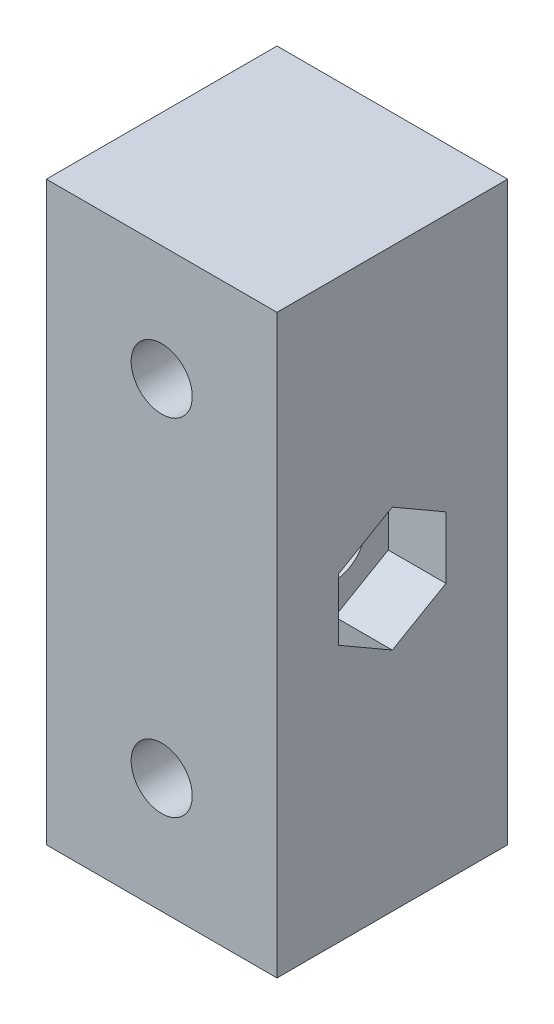
ISO-10303-21;
HEADER;
FILE_DESCRIPTION(('STEP AP214'),'2;1');
FILE_NAME('part.step','',(''),(''),'','','');
FILE_SCHEMA(('AUTOMOTIVE_DESIGN { 1 0 10303 214 1 1 1 1 }'));
ENDSEC;
DATA;
#1=APPLICATION_CONTEXT('core data for automotive mechanical design processes');
#2=APPLICATION_PROTOCOL_DEFINITION('international standard','automotive_design',2000,#1);
#3=PRODUCT_CONTEXT('',#1,'mechanical');
#4=PRODUCT('Part','Part','',(#3));
#5=PRODUCT_RELATED_PRODUCT_CATEGORY('part','',(#4));
#6=PRODUCT_DEFINITION_FORMATION('','',#4);
#7=PRODUCT_DEFINITION_CONTEXT('part definition',#1,'design');
#8=PRODUCT_DEFINITION('design','',#6,#7);
#9=PRODUCT_DEFINITION_SHAPE('','',#8);
#10=(LENGTH_UNIT() NAMED_UNIT(*) SI_UNIT(.MILLI.,.METRE.));
#11=(NAMED_UNIT(*) PLANE_ANGLE_UNIT() SI_UNIT($,.RADIAN.));
#12=(NAMED_UNIT(*) SI_UNIT($,.STERADIAN.) SOLID_ANGLE_UNIT());
#13=UNCERTAINTY_MEASURE_WITH_UNIT(LENGTH_MEASURE(1.E-05),#10,'distance_accuracy_value','');
#14=(GEOMETRIC_REPRESENTATION_CONTEXT(3) GLOBAL_UNCERTAINTY_ASSIGNED_CONTEXT((#13)) GLOBAL_UNIT_ASSIGNED_CONTEXT((#10,
#11,#12)) REPRESENTATION_CONTEXT('',''));
#15=CARTESIAN_POINT('',(0.,0.,0.));
#16=DIRECTION('',(0.,0.,1.));
#17=DIRECTION('',(1.,0.,0.));
#18=AXIS2_PLACEMENT_3D('',#15,#16,#17);
#19=CARTESIAN_POINT('',(865.,5.,-700.));
#20=DIRECTION('',(0.,1.,0.));
#21=DIRECTION('',(0.,0.,1.));
#22=AXIS2_PLACEMENT_3D('',#19,#20,#21);
#23=PLANE('',#22);
#24=DIRECTION('',(0.,0.,-1.));
#25=VECTOR('',#24,1.);
#26=CARTESIAN_POINT('',(885.,5.,0.));
#27=LINE('',#26,#25);
#28=CARTESIAN_POINT('',(885.,5.,-680.));
#29=VERTEX_POINT('',#28);
#30=CARTESIAN_POINT('',(885.,5.,-700.));
#31=VERTEX_POINT('',#30);
#32=EDGE_CURVE('E42',#29,#31,#27,.T.);
#33=ORIENTED_EDGE('',*,*,#32,.F.);
#34=DIRECTION('',(1.,0.,0.));
#35=VECTOR('',#34,1.);
#36=CARTESIAN_POINT('',(885.,5.,-680.));
#37=LINE('',#36,#35);
#38=CARTESIAN_POINT('',(865.,5.,-680.));
#39=VERTEX_POINT('',#38);
#40=EDGE_CURVE('E159',#39,#29,#37,.T.);
#41=ORIENTED_EDGE('',*,*,#40,.F.);
#42=DIRECTION('',(0.,0.,1.));
#43=VECTOR('',#42,1.);
#44=CARTESIAN_POINT('',(865.,5.,-700.));
#45=LINE('',#44,#43);
#46=CARTESIAN_POINT('',(865.,5.,-700.));
#47=VERTEX_POINT('',#46);
#48=EDGE_CURVE('E155',#47,#39,#45,.T.);
#49=ORIENTED_EDGE('',*,*,#48,.F.);
#50=DIRECTION('',(-1.,0.,0.));
#51=VECTOR('',#50,1.);
#52=CARTESIAN_POINT('',(0.,5.,-700.));
#53=LINE('',#52,#51);
#54=EDGE_CURVE('E141',#31,#47,#53,.T.);
#55=ORIENTED_EDGE('',*,*,#54,.F.);
#56=EDGE_LOOP('',(#33,#41,#49,#55));
#57=FACE_BOUND('',#56,.T.);
#58=ADVANCED_FACE('F38',(#57),#23,.F.);
#59=CARTESIAN_POINT('',(880.,0.,-700.));
#60=DIRECTION('',(-1.,0.,0.));
#61=DIRECTION('',(0.,0.,-1.));
#62=AXIS2_PLACEMENT_3D('',#59,#60,#61);
#63=PLANE('',#62);
#64=CARTESIAN_POINT('',(880.,30.,-690.));
#65=DIRECTION('',(-1.,0.,0.));
#66=DIRECTION('',(0.,0.,1.));
#67=AXIS2_PLACEMENT_3D('',#64,#65,#66);
#68=CIRCLE('',#67,2.65);
#69=CARTESIAN_POINT('',(880.,30.,-687.35));
#70=VERTEX_POINT('',#69);
#71=EDGE_CURVE('E236',#70,#70,#68,.T.);
#72=ORIENTED_EDGE('',*,*,#71,.T.);
#73=EDGE_LOOP('',(#72));
#74=FACE_BOUND('',#73,.T.);
#75=DIRECTION('',(0.,0.499999999999991,0.866025403784444));
#76=VECTOR('',#75,1.);
#77=CARTESIAN_POINT('',(880.,32.6846787517318,-694.65));
#78=LINE('',#77,#76);
#79=CARTESIAN_POINT('',(880.,32.6846787517318,-694.65));
#80=VERTEX_POINT('',#79);
#81=CARTESIAN_POINT('',(880.,35.3693575034635,-690.));
#82=VERTEX_POINT('',#81);
#83=EDGE_CURVE('E138',#80,#82,#78,.T.);
#84=ORIENTED_EDGE('',*,*,#83,.T.);
#85=DIRECTION('',(0.,-0.500000000000002,0.866025403784438));
#86=VECTOR('',#85,1.);
#87=CARTESIAN_POINT('',(880.,35.3693575034635,-690.));
#88=LINE('',#87,#86);
#89=CARTESIAN_POINT('',(880.,32.6846787517318,-685.35));
#90=VERTEX_POINT('',#89);
#91=EDGE_CURVE('E126',#82,#90,#88,.T.);
#92=ORIENTED_EDGE('',*,*,#91,.T.);
#93=DIRECTION('',(0.,1.,0.));
#94=VECTOR('',#93,1.);
#95=CARTESIAN_POINT('',(880.,27.3153212482683,-685.35));
#96=LINE('',#95,#94);
#97=CARTESIAN_POINT('',(880.,27.3153212482683,-685.35));
#98=VERTEX_POINT('',#97);
#99=EDGE_CURVE('E129',#98,#90,#96,.T.);
#100=ORIENTED_EDGE('',*,*,#99,.F.);
#101=DIRECTION('',(0.,0.5,0.866025403784439));
#102=VECTOR('',#101,1.);
#103=CARTESIAN_POINT('',(880.,24.6306424965365,-690.));
#104=LINE('',#103,#102);
#105=CARTESIAN_POINT('',(880.,24.6306424965365,-690.));
#106=VERTEX_POINT('',#105);
#107=EDGE_CURVE('E132',#106,#98,#104,.T.);
#108=ORIENTED_EDGE('',*,*,#107,.F.);
#109=DIRECTION('',(0.,0.500000000000003,-0.866025403784437));
#110=VECTOR('',#109,1.);
#111=CARTESIAN_POINT('',(880.,24.6306424965365,-690.));
#112=LINE('',#111,#110);
#113=CARTESIAN_POINT('',(880.,27.3153212482683,-694.65));
#114=VERTEX_POINT('',#113);
#115=EDGE_CURVE('E105',#106,#114,#112,.T.);
#116=ORIENTED_EDGE('',*,*,#115,.T.);
#117=DIRECTION('',(0.,1.,0.));
#118=VECTOR('',#117,1.);
#119=CARTESIAN_POINT('',(880.,27.3153212482683,-694.65));
#120=LINE('',#119,#118);
#121=EDGE_CURVE('E135',#114,#80,#120,.T.);
#122=ORIENTED_EDGE('',*,*,#121,.T.);
#123=EDGE_LOOP('',(#84,#92,#100,#108,#116,#122));
#124=FACE_BOUND('',#123,.T.);
#125=ADVANCED_FACE('F316',(#74,#124),#63,.F.);
#126=CARTESIAN_POINT('',(0.,0.,-695.));
#127=DIRECTION('',(0.,0.,-1.));
#128=DIRECTION('',(1.,0.,0.));
#129=AXIS2_PLACEMENT_3D('',#126,#127,#128);
#130=PLANE('',#129);
#131=CARTESIAN_POINT('',(875.,15.,-695.));
#132=DIRECTION('',(0.,0.,-1.));
#133=DIRECTION('',(-1.,0.,0.));
#134=AXIS2_PLACEMENT_3D('',#131,#132,#133);
#135=CIRCLE('',#134,2.64999999999999);
#136=CARTESIAN_POINT('',(872.35,15.,-695.));
#137=VERTEX_POINT('',#136);
#138=EDGE_CURVE('E196',#137,#137,#135,.T.);
#139=ORIENTED_EDGE('',*,*,#138,.F.);
#140=EDGE_LOOP('',(#139));
#141=FACE_BOUND('',#140,.T.);
#142=DIRECTION('',(0.866025403784438,0.500000000000001,0.));
#143=VECTOR('',#142,1.);
#144=CARTESIAN_POINT('',(875.,9.63064249653649,-695.));
#145=LINE('',#144,#143);
#146=CARTESIAN_POINT('',(875.,9.63064249653649,-695.));
#147=VERTEX_POINT('',#146);
#148=CARTESIAN_POINT('',(879.65,12.3153212482683,-695.));
#149=VERTEX_POINT('',#148);
#150=EDGE_CURVE('E276',#147,#149,#145,.T.);
#151=ORIENTED_EDGE('',*,*,#150,.F.);
#152=DIRECTION('',(-0.866025403784436,0.500000000000004,0.));
#153=VECTOR('',#152,1.);
#154=CARTESIAN_POINT('',(875.,9.63064249653649,-695.));
#155=LINE('',#154,#153);
#156=CARTESIAN_POINT('',(870.35,12.3153212482682,-695.));
#157=VERTEX_POINT('',#156);
#158=EDGE_CURVE('E301',#147,#157,#155,.T.);
#159=ORIENTED_EDGE('',*,*,#158,.T.);
#160=DIRECTION('',(0.,1.,0.));
#161=VECTOR('',#160,1.);
#162=CARTESIAN_POINT('',(870.35,12.3153212482682,-695.));
#163=LINE('',#162,#161);
#164=CARTESIAN_POINT('',(870.35,17.6846787517318,-695.));
#165=VERTEX_POINT('',#164);
#166=EDGE_CURVE('E298',#157,#165,#163,.T.);
#167=ORIENTED_EDGE('',*,*,#166,.T.);
#168=DIRECTION('',(0.866025403784443,0.499999999999993,0.));
#169=VECTOR('',#168,1.);
#170=CARTESIAN_POINT('',(870.35,17.6846787517318,-695.));
#171=LINE('',#170,#169);
#172=CARTESIAN_POINT('',(875.,20.3693575034635,-695.));
#173=VERTEX_POINT('',#172);
#174=EDGE_CURVE('E295',#165,#173,#171,.T.);
#175=ORIENTED_EDGE('',*,*,#174,.T.);
#176=DIRECTION('',(0.866025403784438,-0.500000000000002,0.));
#177=VECTOR('',#176,1.);
#178=CARTESIAN_POINT('',(875.,20.3693575034635,-695.));
#179=LINE('',#178,#177);
#180=CARTESIAN_POINT('',(879.65,17.6846787517318,-695.));
#181=VERTEX_POINT('',#180);
#182=EDGE_CURVE('E292',#173,#181,#179,.T.);
#183=ORIENTED_EDGE('',*,*,#182,.T.);
#184=DIRECTION('',(0.,1.,0.));
#185=VECTOR('',#184,1.);
#186=CARTESIAN_POINT('',(879.65,12.3153212482683,-695.));
#187=LINE('',#186,#185);
#188=EDGE_CURVE('E256',#149,#181,#187,.T.);
#189=ORIENTED_EDGE('',*,*,#188,.F.);
#190=EDGE_LOOP('',(#151,#159,#167,#175,#183,#189));
#191=FACE_BOUND('',#190,.T.);
#192=ADVANCED_FACE('F338',(#141,#191),#130,.T.);
#193=CARTESIAN_POINT('',(0.,0.,-695.));
#194=DIRECTION('',(0.,0.,1.));
#195=DIRECTION('',(-1.,0.,0.));
#196=AXIS2_PLACEMENT_3D('',#193,#194,#195);
#197=PLANE('',#196);
#198=CARTESIAN_POINT('',(875.,45.,-695.));
#199=DIRECTION('',(0.,0.,1.));
#200=DIRECTION('',(1.,0.,0.));
#201=AXIS2_PLACEMENT_3D('',#198,#199,#200);
#202=CIRCLE('',#201,2.64999999999999);
#203=CARTESIAN_POINT('',(877.65,45.,-695.));
#204=VERTEX_POINT('',#203);
#205=EDGE_CURVE('E163',#204,#204,#202,.T.);
#206=ORIENTED_EDGE('',*,*,#205,.T.);
#207=EDGE_LOOP('',(#206));
#208=FACE_BOUND('',#207,.T.);
#209=DIRECTION('',(-0.866025403784436,0.500000000000004,0.));
#210=VECTOR('',#209,1.);
#211=CARTESIAN_POINT('',(875.,39.6306424965365,-695.));
#212=LINE('',#211,#210);
#213=CARTESIAN_POINT('',(875.,39.6306424965365,-695.));
#214=VERTEX_POINT('',#213);
#215=CARTESIAN_POINT('',(870.35,42.3153212482682,-695.));
#216=VERTEX_POINT('',#215);
#217=EDGE_CURVE('E221',#214,#216,#212,.T.);
#218=ORIENTED_EDGE('',*,*,#217,.T.);
#219=DIRECTION('',(0.,1.,0.));
#220=VECTOR('',#219,1.);
#221=CARTESIAN_POINT('',(870.35,42.3153212482682,-695.));
#222=LINE('',#221,#220);
#223=CARTESIAN_POINT('',(870.35,47.6846787517318,-695.));
#224=VERTEX_POINT('',#223);
#225=EDGE_CURVE('E216',#216,#224,#222,.T.);
#226=ORIENTED_EDGE('',*,*,#225,.T.);
#227=DIRECTION('',(0.866025403784443,0.499999999999992,0.));
#228=VECTOR('',#227,1.);
#229=CARTESIAN_POINT('',(870.35,47.6846787517318,-695.));
#230=LINE('',#229,#228);
#231=CARTESIAN_POINT('',(875.,50.3693575034635,-695.));
#232=VERTEX_POINT('',#231);
#233=EDGE_CURVE('E239',#224,#232,#230,.T.);
#234=ORIENTED_EDGE('',*,*,#233,.T.);
#235=DIRECTION('',(0.866025403784438,-0.500000000000001,0.));
#236=VECTOR('',#235,1.);
#237=CARTESIAN_POINT('',(875.,50.3693575034635,-695.));
#238=LINE('',#237,#236);
#239=CARTESIAN_POINT('',(879.65,47.6846787517318,-695.));
#240=VERTEX_POINT('',#239);
#241=EDGE_CURVE('E242',#232,#240,#238,.T.);
#242=ORIENTED_EDGE('',*,*,#241,.T.);
#243=DIRECTION('',(0.,1.,0.));
#244=VECTOR('',#243,1.);
#245=CARTESIAN_POINT('',(879.65,42.3153212482683,-695.));
#246=LINE('',#245,#244);
#247=CARTESIAN_POINT('',(879.65,42.3153212482683,-695.));
#248=VERTEX_POINT('',#247);
#249=EDGE_CURVE('E245',#248,#240,#246,.T.);
#250=ORIENTED_EDGE('',*,*,#249,.F.);
#251=DIRECTION('',(0.866025403784439,0.5,0.));
#252=VECTOR('',#251,1.);
#253=CARTESIAN_POINT('',(875.,39.6306424965365,-695.));
#254=LINE('',#253,#252);
#255=EDGE_CURVE('E248',#214,#248,#254,.T.);
#256=ORIENTED_EDGE('',*,*,#255,.F.);
#257=EDGE_LOOP('',(#218,#226,#234,#242,#250,#256));
#258=FACE_BOUND('',#257,.T.);
#259=ADVANCED_FACE('F387',(#208,#258),#197,.F.);
#260=CARTESIAN_POINT('',(870.35,47.6846787517318,-695.));
#261=DIRECTION('',(-0.499999999999992,0.866025403784443,0.));
#262=DIRECTION('',(-0.866025403784443,-0.499999999999992,0.));
#263=AXIS2_PLACEMENT_3D('',#260,#261,#262);
#264=PLANE('',#263);
#265=DIRECTION('',(0.866025403784443,0.499999999999992,0.));
#266=VECTOR('',#265,1.);
#267=CARTESIAN_POINT('',(870.35,47.6846787517318,-700.));
#268=LINE('',#267,#266);
#269=CARTESIAN_POINT('',(870.35,47.6846787517318,-700.));
#270=VERTEX_POINT('',#269);
#271=CARTESIAN_POINT('',(875.,50.3693575034635,-700.));
#272=VERTEX_POINT('',#271);
#273=EDGE_CURVE('E220',#270,#272,#268,.T.);
#274=ORIENTED_EDGE('',*,*,#273,.T.);
#275=DIRECTION('',(0.,0.,-1.));
#276=VECTOR('',#275,1.);
#277=CARTESIAN_POINT('',(875.,50.3693575034635,-695.));
#278=LINE('',#277,#276);
#279=EDGE_CURVE('E207',#232,#272,#278,.T.);
#280=ORIENTED_EDGE('',*,*,#279,.F.);
#281=ORIENTED_EDGE('',*,*,#233,.F.);
#282=DIRECTION('',(0.,0.,-1.));
#283=VECTOR('',#282,1.);
#284=CARTESIAN_POINT('',(870.35,47.6846787517318,-695.));
#285=LINE('',#284,#283);
#286=EDGE_CURVE('E210',#224,#270,#285,.T.);
#287=ORIENTED_EDGE('',*,*,#286,.T.);
#288=EDGE_LOOP('',(#274,#280,#281,#287));
#289=FACE_BOUND('',#288,.T.);
#290=ADVANCED_FACE('F383',(#289),#264,.F.);
#291=CARTESIAN_POINT('',(875.,50.3693575034635,-695.));
#292=DIRECTION('',(0.500000000000001,0.866025403784438,0.));
#293=DIRECTION('',(-0.866025403784438,0.500000000000001,0.));
#294=AXIS2_PLACEMENT_3D('',#291,#292,#293);
#295=PLANE('',#294);
#296=DIRECTION('',(0.866025403784438,-0.500000000000001,0.));
#297=VECTOR('',#296,1.);
#298=CARTESIAN_POINT('',(875.,50.3693575034635,-700.));
#299=LINE('',#298,#297);
#300=CARTESIAN_POINT('',(879.65,47.6846787517318,-700.));
#301=VERTEX_POINT('',#300);
#302=EDGE_CURVE('E224',#272,#301,#299,.T.);
#303=ORIENTED_EDGE('',*,*,#302,.T.);
#304=DIRECTION('',(0.,0.,-1.));
#305=VECTOR('',#304,1.);
#306=CARTESIAN_POINT('',(879.65,47.6846787517318,-695.));
#307=LINE('',#306,#305);
#308=EDGE_CURVE('E204',#240,#301,#307,.T.);
#309=ORIENTED_EDGE('',*,*,#308,.F.);
#310=ORIENTED_EDGE('',*,*,#241,.F.);
#311=ORIENTED_EDGE('',*,*,#279,.T.);
#312=EDGE_LOOP('',(#303,#309,#310,#311));
#313=FACE_BOUND('',#312,.T.);
#314=ADVANCED_FACE('F379',(#313),#295,.F.);
#315=CARTESIAN_POINT('',(879.65,42.3153212482683,-695.));
#316=DIRECTION('',(-1.,0.,0.));
#317=DIRECTION('',(0.,0.,1.));
#318=AXIS2_PLACEMENT_3D('',#315,#316,#317);
#319=PLANE('',#318);
#320=DIRECTION('',(0.,1.,0.));
#321=VECTOR('',#320,1.);
#322=CARTESIAN_POINT('',(879.65,42.3153212482683,-700.));
#323=LINE('',#322,#321);
#324=CARTESIAN_POINT('',(879.65,42.3153212482683,-700.));
#325=VERTEX_POINT('',#324);
#326=EDGE_CURVE('E227',#325,#301,#323,.T.);
#327=ORIENTED_EDGE('',*,*,#326,.F.);
#328=DIRECTION('',(0.,0.,-1.));
#329=VECTOR('',#328,1.);
#330=CARTESIAN_POINT('',(879.65,42.3153212482683,-695.));
#331=LINE('',#330,#329);
#332=EDGE_CURVE('E200',#248,#325,#331,.T.);
#333=ORIENTED_EDGE('',*,*,#332,.F.);
#334=ORIENTED_EDGE('',*,*,#249,.T.);
#335=ORIENTED_EDGE('',*,*,#308,.T.);
#336=EDGE_LOOP('',(#327,#333,#334,#335));
#337=FACE_BOUND('',#336,.T.);
#338=ADVANCED_FACE('F375',(#337),#319,.T.);
#339=CARTESIAN_POINT('',(875.,39.6306424965365,-695.));
#340=DIRECTION('',(-0.5,0.866025403784439,0.));
#341=DIRECTION('',(-0.866025403784439,-0.5,0.));
#342=AXIS2_PLACEMENT_3D('',#339,#340,#341);
#343=PLANE('',#342);
#344=DIRECTION('',(0.866025403784439,0.5,0.));
#345=VECTOR('',#344,1.);
#346=CARTESIAN_POINT('',(875.,39.6306424965365,-700.));
#347=LINE('',#346,#345);
#348=CARTESIAN_POINT('',(875.,39.6306424965365,-700.));
#349=VERTEX_POINT('',#348);
#350=EDGE_CURVE('E230',#349,#325,#347,.T.);
#351=ORIENTED_EDGE('',*,*,#350,.F.);
#352=DIRECTION('',(0.,0.,-1.));
#353=VECTOR('',#352,1.);
#354=CARTESIAN_POINT('',(875.,39.6306424965365,-695.));
#355=LINE('',#354,#353);
#356=EDGE_CURVE('E197',#214,#349,#355,.T.);
#357=ORIENTED_EDGE('',*,*,#356,.F.);
#358=ORIENTED_EDGE('',*,*,#255,.T.);
#359=ORIENTED_EDGE('',*,*,#332,.T.);
#360=EDGE_LOOP('',(#351,#357,#358,#359));
#361=FACE_BOUND('',#360,.T.);
#362=ADVANCED_FACE('F371',(#361),#343,.T.);
#363=CARTESIAN_POINT('',(875.,39.6306424965365,-695.));
#364=DIRECTION('',(-0.500000000000004,-0.866025403784436,0.));
#365=DIRECTION('',(0.866025403784436,-0.500000000000004,0.));
#366=AXIS2_PLACEMENT_3D('',#363,#364,#365);
#367=PLANE('',#366);
#368=DIRECTION('',(-0.866025403784436,0.500000000000004,0.));
#369=VECTOR('',#368,1.);
#370=CARTESIAN_POINT('',(875.,39.6306424965365,-700.));
#371=LINE('',#370,#369);
#372=CARTESIAN_POINT('',(870.35,42.3153212482682,-700.));
#373=VERTEX_POINT('',#372);
#374=EDGE_CURVE('E233',#349,#373,#371,.T.);
#375=ORIENTED_EDGE('',*,*,#374,.T.);
#376=DIRECTION('',(0.,0.,-1.));
#377=VECTOR('',#376,1.);
#378=CARTESIAN_POINT('',(870.35,42.3153212482682,-695.));
#379=LINE('',#378,#377);
#380=EDGE_CURVE('E213',#216,#373,#379,.T.);
#381=ORIENTED_EDGE('',*,*,#380,.F.);
#382=ORIENTED_EDGE('',*,*,#217,.F.);
#383=ORIENTED_EDGE('',*,*,#356,.T.);
#384=EDGE_LOOP('',(#375,#381,#382,#383));
#385=FACE_BOUND('',#384,.T.);
#386=ADVANCED_FACE('F367',(#385),#367,.F.);
#387=CARTESIAN_POINT('',(870.35,42.3153212482682,-695.));
#388=DIRECTION('',(-1.,0.,0.));
#389=DIRECTION('',(0.,-1.,0.));
#390=AXIS2_PLACEMENT_3D('',#387,#388,#389);
#391=PLANE('',#390);
#392=DIRECTION('',(0.,1.,0.));
#393=VECTOR('',#392,1.);
#394=CARTESIAN_POINT('',(870.35,42.3153212482682,-700.));
#395=LINE('',#394,#393);
#396=EDGE_CURVE('E217',#373,#270,#395,.T.);
#397=ORIENTED_EDGE('',*,*,#396,.T.);
#398=ORIENTED_EDGE('',*,*,#286,.F.);
#399=ORIENTED_EDGE('',*,*,#225,.F.);
#400=ORIENTED_EDGE('',*,*,#380,.T.);
#401=EDGE_LOOP('',(#397,#398,#399,#400));
#402=FACE_BOUND('',#401,.T.);
#403=ADVANCED_FACE('F370',(#402),#391,.F.);
#404=CARTESIAN_POINT('',(875.,9.63064249653649,-695.));
#405=DIRECTION('',(-0.500000000000004,-0.866025403784436,0.));
#406=DIRECTION('',(0.866025403784436,-0.500000000000004,0.));
#407=AXIS2_PLACEMENT_3D('',#404,#405,#406);
#408=PLANE('',#407);
#409=DIRECTION('',(-0.866025403784436,0.500000000000004,0.));
#410=VECTOR('',#409,1.);
#411=CARTESIAN_POINT('',(875.,9.63064249653649,-700.));
#412=LINE('',#411,#410);
#413=CARTESIAN_POINT('',(875.,9.6306424965365,-700.));
#414=VERTEX_POINT('',#413);
#415=CARTESIAN_POINT('',(870.35,12.3153212482682,-700.));
#416=VERTEX_POINT('',#415);
#417=EDGE_CURVE('E285',#414,#416,#412,.T.);
#418=ORIENTED_EDGE('',*,*,#417,.T.);
#419=DIRECTION('',(0.,0.,-1.));
#420=VECTOR('',#419,1.);
#421=CARTESIAN_POINT('',(870.35,12.3153212482682,-695.));
#422=LINE('',#421,#420);
#423=EDGE_CURVE('E257',#157,#416,#422,.T.);
#424=ORIENTED_EDGE('',*,*,#423,.F.);
#425=ORIENTED_EDGE('',*,*,#158,.F.);
#426=DIRECTION('',(0.,0.,-1.));
#427=VECTOR('',#426,1.);
#428=CARTESIAN_POINT('',(875.,9.63064249653649,-695.));
#429=LINE('',#428,#427);
#430=EDGE_CURVE('E253',#147,#414,#429,.T.);
#431=ORIENTED_EDGE('',*,*,#430,.T.);
#432=EDGE_LOOP('',(#418,#424,#425,#431));
#433=FACE_BOUND('',#432,.T.);
#434=ADVANCED_FACE('F391',(#433),#408,.F.);
#435=CARTESIAN_POINT('',(870.35,12.3153212482682,-695.));
#436=DIRECTION('',(-1.,0.,0.));
#437=DIRECTION('',(0.,-1.,0.));
#438=AXIS2_PLACEMENT_3D('',#435,#436,#437);
#439=PLANE('',#438);
#440=DIRECTION('',(0.,1.,0.));
#441=VECTOR('',#440,1.);
#442=CARTESIAN_POINT('',(870.35,12.3153212482682,-700.));
#443=LINE('',#442,#441);
#444=CARTESIAN_POINT('',(870.35,17.6846787517318,-700.));
#445=VERTEX_POINT('',#444);
#446=EDGE_CURVE('E282',#416,#445,#443,.T.);
#447=ORIENTED_EDGE('',*,*,#446,.T.);
#448=DIRECTION('',(0.,0.,-1.));
#449=VECTOR('',#448,1.);
#450=CARTESIAN_POINT('',(870.35,17.6846787517318,-695.));
#451=LINE('',#450,#449);
#452=EDGE_CURVE('E260',#165,#445,#451,.T.);
#453=ORIENTED_EDGE('',*,*,#452,.F.);
#454=ORIENTED_EDGE('',*,*,#166,.F.);
#455=ORIENTED_EDGE('',*,*,#423,.T.);
#456=EDGE_LOOP('',(#447,#453,#454,#455));
#457=FACE_BOUND('',#456,.T.);
#458=ADVANCED_FACE('F403',(#457),#439,.F.);
#459=CARTESIAN_POINT('',(870.35,17.6846787517318,-695.));
#460=DIRECTION('',(-0.499999999999993,0.866025403784443,0.));
#461=DIRECTION('',(-0.866025403784443,-0.499999999999993,0.));
#462=AXIS2_PLACEMENT_3D('',#459,#460,#461);
#463=PLANE('',#462);
#464=DIRECTION('',(0.866025403784443,0.499999999999993,0.));
#465=VECTOR('',#464,1.);
#466=CARTESIAN_POINT('',(870.35,17.6846787517318,-700.));
#467=LINE('',#466,#465);
#468=CARTESIAN_POINT('',(875.,20.3693575034635,-700.));
#469=VERTEX_POINT('',#468);
#470=EDGE_CURVE('E279',#445,#469,#467,.T.);
#471=ORIENTED_EDGE('',*,*,#470,.T.);
#472=DIRECTION('',(0.,0.,-1.));
#473=VECTOR('',#472,1.);
#474=CARTESIAN_POINT('',(875.,20.3693575034635,-695.));
#475=LINE('',#474,#473);
#476=EDGE_CURVE('E263',#173,#469,#475,.T.);
#477=ORIENTED_EDGE('',*,*,#476,.F.);
#478=ORIENTED_EDGE('',*,*,#174,.F.);
#479=ORIENTED_EDGE('',*,*,#452,.T.);
#480=EDGE_LOOP('',(#471,#477,#478,#479));
#481=FACE_BOUND('',#480,.T.);
#482=ADVANCED_FACE('F407',(#481),#463,.F.);
#483=CARTESIAN_POINT('',(875.,20.3693575034635,-695.));
#484=DIRECTION('',(0.500000000000002,0.866025403784438,0.));
#485=DIRECTION('',(-0.866025403784437,0.500000000000002,0.));
#486=AXIS2_PLACEMENT_3D('',#483,#484,#485);
#487=PLANE('',#486);
#488=DIRECTION('',(0.866025403784438,-0.500000000000002,0.));
#489=VECTOR('',#488,1.);
#490=CARTESIAN_POINT('',(875.,20.3693575034635,-700.));
#491=LINE('',#490,#489);
#492=CARTESIAN_POINT('',(879.65,17.6846787517318,-700.));
#493=VERTEX_POINT('',#492);
#494=EDGE_CURVE('E275',#469,#493,#491,.T.);
#495=ORIENTED_EDGE('',*,*,#494,.T.);
#496=DIRECTION('',(0.,0.,-1.));
#497=VECTOR('',#496,1.);
#498=CARTESIAN_POINT('',(879.65,17.6846787517318,-695.));
#499=LINE('',#498,#497);
#500=EDGE_CURVE('E266',#181,#493,#499,.T.);
#501=ORIENTED_EDGE('',*,*,#500,.F.);
#502=ORIENTED_EDGE('',*,*,#182,.F.);
#503=ORIENTED_EDGE('',*,*,#476,.T.);
#504=EDGE_LOOP('',(#495,#501,#502,#503));
#505=FACE_BOUND('',#504,.T.);
#506=ADVANCED_FACE('F411',(#505),#487,.F.);
#507=CARTESIAN_POINT('',(879.65,12.3153212482683,-695.));
#508=DIRECTION('',(-1.,0.,0.));
#509=DIRECTION('',(0.,0.,1.));
#510=AXIS2_PLACEMENT_3D('',#507,#508,#509);
#511=PLANE('',#510);
#512=DIRECTION('',(0.,1.,0.));
#513=VECTOR('',#512,1.);
#514=CARTESIAN_POINT('',(879.65,12.3153212482683,-700.));
#515=LINE('',#514,#513);
#516=CARTESIAN_POINT('',(879.65,12.3153212482683,-700.));
#517=VERTEX_POINT('',#516);
#518=EDGE_CURVE('E272',#517,#493,#515,.T.);
#519=ORIENTED_EDGE('',*,*,#518,.F.);
#520=DIRECTION('',(0.,0.,-1.));
#521=VECTOR('',#520,1.);
#522=CARTESIAN_POINT('',(879.65,12.3153212482683,-695.));
#523=LINE('',#522,#521);
#524=EDGE_CURVE('E269',#149,#517,#523,.T.);
#525=ORIENTED_EDGE('',*,*,#524,.F.);
#526=ORIENTED_EDGE('',*,*,#188,.T.);
#527=ORIENTED_EDGE('',*,*,#500,.T.);
#528=EDGE_LOOP('',(#519,#525,#526,#527));
#529=FACE_BOUND('',#528,.T.);
#530=ADVANCED_FACE('F399',(#529),#511,.T.);
#531=CARTESIAN_POINT('',(875.,9.63064249653649,-695.));
#532=DIRECTION('',(-0.500000000000001,0.866025403784438,0.));
#533=DIRECTION('',(-0.866025403784438,-0.500000000000001,0.));
#534=AXIS2_PLACEMENT_3D('',#531,#532,#533);
#535=PLANE('',#534);
#536=DIRECTION('',(0.866025403784438,0.500000000000001,0.));
#537=VECTOR('',#536,1.);
#538=CARTESIAN_POINT('',(875.,9.63064249653649,-700.));
#539=LINE('',#538,#537);
#540=EDGE_CURVE('E201',#414,#517,#539,.T.);
#541=ORIENTED_EDGE('',*,*,#540,.F.);
#542=ORIENTED_EDGE('',*,*,#430,.F.);
#543=ORIENTED_EDGE('',*,*,#150,.T.);
#544=ORIENTED_EDGE('',*,*,#524,.T.);
#545=EDGE_LOOP('',(#541,#542,#543,#544));
#546=FACE_BOUND('',#545,.T.);
#547=ADVANCED_FACE('F396',(#546),#535,.T.);
#548=CARTESIAN_POINT('',(880.,27.3153212482683,-685.35));
#549=DIRECTION('',(0.,0.,-1.));
#550=DIRECTION('',(0.,1.,0.));
#551=AXIS2_PLACEMENT_3D('',#548,#549,#550);
#552=PLANE('',#551);
#553=DIRECTION('',(0.,1.,0.));
#554=VECTOR('',#553,1.);
#555=CARTESIAN_POINT('',(885.,27.3153212482683,-685.35));
#556=LINE('',#555,#554);
#557=CARTESIAN_POINT('',(885.,27.3153212482683,-685.35));
#558=VERTEX_POINT('',#557);
#559=CARTESIAN_POINT('',(885.,32.6846787517318,-685.35));
#560=VERTEX_POINT('',#559);
#561=EDGE_CURVE('E116',#558,#560,#556,.T.);
#562=ORIENTED_EDGE('',*,*,#561,.F.);
#563=DIRECTION('',(1.,0.,0.));
#564=VECTOR('',#563,1.);
#565=CARTESIAN_POINT('',(880.,27.3153212482683,-685.35));
#566=LINE('',#565,#564);
#567=EDGE_CURVE('E108',#98,#558,#566,.T.);
#568=ORIENTED_EDGE('',*,*,#567,.F.);
#569=ORIENTED_EDGE('',*,*,#99,.T.);
#570=DIRECTION('',(1.,0.,0.));
#571=VECTOR('',#570,1.);
#572=CARTESIAN_POINT('',(880.,32.6846787517318,-685.35));
#573=LINE('',#572,#571);
#574=EDGE_CURVE('E90',#90,#560,#573,.T.);
#575=ORIENTED_EDGE('',*,*,#574,.T.);
#576=EDGE_LOOP('',(#562,#568,#569,#575));
#577=FACE_BOUND('',#576,.T.);
#578=ADVANCED_FACE('F313',(#577),#552,.T.);
#579=CARTESIAN_POINT('',(880.,24.6306424965365,-690.));
#580=DIRECTION('',(0.,0.866025403784439,-0.5));
#581=DIRECTION('',(0.,0.5,0.866025403784439));
#582=AXIS2_PLACEMENT_3D('',#579,#580,#581);
#583=PLANE('',#582);
#584=DIRECTION('',(0.,0.5,0.866025403784439));
#585=VECTOR('',#584,1.);
#586=CARTESIAN_POINT('',(885.,24.6306424965365,-690.));
#587=LINE('',#586,#585);
#588=CARTESIAN_POINT('',(885.,24.6306424965365,-690.));
#589=VERTEX_POINT('',#588);
#590=EDGE_CURVE('E111',#589,#558,#587,.T.);
#591=ORIENTED_EDGE('',*,*,#590,.F.);
#592=DIRECTION('',(1.,0.,0.));
#593=VECTOR('',#592,1.);
#594=CARTESIAN_POINT('',(880.,24.6306424965365,-690.));
#595=LINE('',#594,#593);
#596=EDGE_CURVE('E98',#106,#589,#595,.T.);
#597=ORIENTED_EDGE('',*,*,#596,.F.);
#598=ORIENTED_EDGE('',*,*,#107,.T.);
#599=ORIENTED_EDGE('',*,*,#567,.T.);
#600=EDGE_LOOP('',(#591,#597,#598,#599));
#601=FACE_BOUND('',#600,.T.);
#602=ADVANCED_FACE('F112',(#601),#583,.T.);
#603=CARTESIAN_POINT('',(880.,24.6306424965365,-690.));
#604=DIRECTION('',(0.,-0.866025403784437,-0.500000000000003));
#605=DIRECTION('',(0.,0.500000000000003,-0.866025403784437));
#606=AXIS2_PLACEMENT_3D('',#603,#604,#605);
#607=PLANE('',#606);
#608=DIRECTION('',(0.,0.500000000000003,-0.866025403784437));
#609=VECTOR('',#608,1.);
#610=CARTESIAN_POINT('',(885.,24.6306424965365,-690.));
#611=LINE('',#610,#609);
#612=CARTESIAN_POINT('',(885.,27.3153212482683,-694.65));
#613=VERTEX_POINT('',#612);
#614=EDGE_CURVE('E102',#589,#613,#611,.T.);
#615=ORIENTED_EDGE('',*,*,#614,.T.);
#616=DIRECTION('',(1.,0.,0.));
#617=VECTOR('',#616,1.);
#618=CARTESIAN_POINT('',(880.,27.3153212482683,-694.65));
#619=LINE('',#618,#617);
#620=EDGE_CURVE('E80',#114,#613,#619,.T.);
#621=ORIENTED_EDGE('',*,*,#620,.F.);
#622=ORIENTED_EDGE('',*,*,#115,.F.);
#623=ORIENTED_EDGE('',*,*,#596,.T.);
#624=EDGE_LOOP('',(#615,#621,#622,#623));
#625=FACE_BOUND('',#624,.T.);
#626=ADVANCED_FACE('F100',(#625),#607,.F.);
#627=CARTESIAN_POINT('',(880.,27.3153212482683,-694.65));
#628=DIRECTION('',(0.,0.,-1.));
#629=DIRECTION('',(0.,1.,0.));
#630=AXIS2_PLACEMENT_3D('',#627,#628,#629);
#631=PLANE('',#630);
#632=DIRECTION('',(0.,1.,0.));
#633=VECTOR('',#632,1.);
#634=CARTESIAN_POINT('',(885.,27.3153212482683,-694.65));
#635=LINE('',#634,#633);
#636=CARTESIAN_POINT('',(885.,32.6846787517318,-694.65));
#637=VERTEX_POINT('',#636);
#638=EDGE_CURVE('E48',#613,#637,#635,.T.);
#639=ORIENTED_EDGE('',*,*,#638,.T.);
#640=DIRECTION('',(1.,0.,0.));
#641=VECTOR('',#640,1.);
#642=CARTESIAN_POINT('',(880.,32.6846787517318,-694.65));
#643=LINE('',#642,#641);
#644=EDGE_CURVE('E56',#80,#637,#643,.T.);
#645=ORIENTED_EDGE('',*,*,#644,.F.);
#646=ORIENTED_EDGE('',*,*,#121,.F.);
#647=ORIENTED_EDGE('',*,*,#620,.T.);
#648=EDGE_LOOP('',(#639,#645,#646,#647));
#649=FACE_BOUND('',#648,.T.);
#650=ADVANCED_FACE('F323',(#649),#631,.F.);
#651=CARTESIAN_POINT('',(880.,32.6846787517318,-694.65));
#652=DIRECTION('',(0.,0.866025403784444,-0.499999999999991));
#653=DIRECTION('',(0.,0.499999999999991,0.866025403784444));
#654=AXIS2_PLACEMENT_3D('',#651,#652,#653);
#655=PLANE('',#654);
#656=DIRECTION('',(0.,0.499999999999991,0.866025403784444));
#657=VECTOR('',#656,1.);
#658=CARTESIAN_POINT('',(885.,32.6846787517318,-694.65));
#659=LINE('',#658,#657);
#660=CARTESIAN_POINT('',(885.,35.3693575034635,-690.));
#661=VERTEX_POINT('',#660);
#662=EDGE_CURVE('E11',#637,#661,#659,.T.);
#663=ORIENTED_EDGE('',*,*,#662,.T.);
#664=DIRECTION('',(1.,0.,0.));
#665=VECTOR('',#664,1.);
#666=CARTESIAN_POINT('',(880.,35.3693575034635,-690.));
#667=LINE('',#666,#665);
#668=EDGE_CURVE('E130',#82,#661,#667,.T.);
#669=ORIENTED_EDGE('',*,*,#668,.F.);
#670=ORIENTED_EDGE('',*,*,#83,.F.);
#671=ORIENTED_EDGE('',*,*,#644,.T.);
#672=EDGE_LOOP('',(#663,#669,#670,#671));
#673=FACE_BOUND('',#672,.T.);
#674=ADVANCED_FACE('F322',(#673),#655,.F.);
#675=CARTESIAN_POINT('',(880.,35.3693575034635,-690.));
#676=DIRECTION('',(0.,0.866025403784438,0.500000000000002));
#677=DIRECTION('',(0.,-0.500000000000002,0.866025403784438));
#678=AXIS2_PLACEMENT_3D('',#675,#676,#677);
#679=PLANE('',#678);
#680=DIRECTION('',(0.,-0.500000000000002,0.866025403784438));
#681=VECTOR('',#680,1.);
#682=CARTESIAN_POINT('',(885.,35.3693575034635,-690.));
#683=LINE('',#682,#681);
#684=EDGE_CURVE('E140',#661,#560,#683,.T.);
#685=ORIENTED_EDGE('',*,*,#684,.T.);
#686=ORIENTED_EDGE('',*,*,#574,.F.);
#687=ORIENTED_EDGE('',*,*,#91,.F.);
#688=ORIENTED_EDGE('',*,*,#668,.T.);
#689=EDGE_LOOP('',(#685,#686,#687,#688));
#690=FACE_BOUND('',#689,.T.);
#691=ADVANCED_FACE('F319',(#690),#679,.F.);
#692=CARTESIAN_POINT('',(0.,5.,-700.));
#693=DIRECTION('',(0.,0.,1.));
#694=DIRECTION('',(1.,0.,0.));
#695=AXIS2_PLACEMENT_3D('',#692,#693,#694);
#696=PLANE('',#695);
#697=ORIENTED_EDGE('',*,*,#540,.T.);
#698=ORIENTED_EDGE('',*,*,#518,.T.);
#699=ORIENTED_EDGE('',*,*,#494,.F.);
#700=ORIENTED_EDGE('',*,*,#470,.F.);
#701=ORIENTED_EDGE('',*,*,#446,.F.);
#702=ORIENTED_EDGE('',*,*,#417,.F.);
#703=EDGE_LOOP('',(#697,#698,#699,#700,#701,#702));
#704=FACE_BOUND('',#703,.T.);
#705=ORIENTED_EDGE('',*,*,#396,.F.);
#706=ORIENTED_EDGE('',*,*,#374,.F.);
#707=ORIENTED_EDGE('',*,*,#350,.T.);
#708=ORIENTED_EDGE('',*,*,#326,.T.);
#709=ORIENTED_EDGE('',*,*,#302,.F.);
#710=ORIENTED_EDGE('',*,*,#273,.F.);
#711=EDGE_LOOP('',(#705,#706,#707,#708,#709,#710));
#712=FACE_BOUND('',#711,.T.);
#713=DIRECTION('',(0.,-1.,0.));
#714=VECTOR('',#713,1.);
#715=CARTESIAN_POINT('',(885.,5.,-700.));
#716=LINE('',#715,#714);
#717=CARTESIAN_POINT('',(885.,55.,-700.));
#718=VERTEX_POINT('',#717);
#719=EDGE_CURVE('E150',#718,#31,#716,.T.);
#720=ORIENTED_EDGE('',*,*,#719,.T.);
#721=ORIENTED_EDGE('',*,*,#54,.T.);
#722=DIRECTION('',(0.,-1.,0.));
#723=VECTOR('',#722,1.);
#724=CARTESIAN_POINT('',(865.,55.,-700.));
#725=LINE('',#724,#723);
#726=CARTESIAN_POINT('',(865.,55.,-700.));
#727=VERTEX_POINT('',#726);
#728=EDGE_CURVE('E184',#727,#47,#725,.T.);
#729=ORIENTED_EDGE('',*,*,#728,.F.);
#730=DIRECTION('',(-1.,0.,0.));
#731=VECTOR('',#730,1.);
#732=CARTESIAN_POINT('',(885.,55.,-700.));
#733=LINE('',#732,#731);
#734=EDGE_CURVE('E168',#718,#727,#733,.T.);
#735=ORIENTED_EDGE('',*,*,#734,.F.);
#736=EDGE_LOOP('',(#720,#721,#729,#735));
#737=FACE_BOUND('',#736,.T.);
#738=ADVANCED_FACE('F40',(#704,#712,#737),#696,.F.);
#739=CARTESIAN_POINT('',(885.,30.,-690.));
#740=DIRECTION('',(-1.,0.,0.));
#741=DIRECTION('',(0.,0.,1.));
#742=AXIS2_PLACEMENT_3D('',#739,#740,#741);
#743=CYLINDRICAL_SURFACE('',#742,2.65);
#744=ORIENTED_EDGE('',*,*,#71,.F.);
#745=EDGE_LOOP('',(#744));
#746=FACE_BOUND('',#745,.T.);
#747=CARTESIAN_POINT('',(865.,30.,-690.));
#748=DIRECTION('',(1.,0.,0.));
#749=DIRECTION('',(0.,0.,-1.));
#750=AXIS2_PLACEMENT_3D('',#747,#748,#749);
#751=CIRCLE('',#750,2.65);
#752=CARTESIAN_POINT('',(865.,30.,-692.65));
#753=VERTEX_POINT('',#752);
#754=EDGE_CURVE('E191',#753,#753,#751,.T.);
#755=ORIENTED_EDGE('',*,*,#754,.F.);
#756=EDGE_LOOP('',(#755));
#757=FACE_BOUND('',#756,.T.);
#758=ADVANCED_FACE('F359',(#746,#757),#743,.F.);
#759=CARTESIAN_POINT('',(865.,55.,-700.));
#760=DIRECTION('',(1.,0.,0.));
#761=DIRECTION('',(0.,0.,-1.));
#762=AXIS2_PLACEMENT_3D('',#759,#760,#761);
#763=PLANE('',#762);
#764=ORIENTED_EDGE('',*,*,#754,.T.);
#765=EDGE_LOOP('',(#764));
#766=FACE_BOUND('',#765,.T.);
#767=ORIENTED_EDGE('',*,*,#48,.T.);
#768=DIRECTION('',(0.,-1.,0.));
#769=VECTOR('',#768,1.);
#770=CARTESIAN_POINT('',(865.,55.,-680.));
#771=LINE('',#770,#769);
#772=CARTESIAN_POINT('',(865.,55.,-680.));
#773=VERTEX_POINT('',#772);
#774=EDGE_CURVE('E181',#773,#39,#771,.T.);
#775=ORIENTED_EDGE('',*,*,#774,.F.);
#776=DIRECTION('',(0.,0.,1.));
#777=VECTOR('',#776,1.);
#778=CARTESIAN_POINT('',(865.,55.,-700.));
#779=LINE('',#778,#777);
#780=EDGE_CURVE('E171',#727,#773,#779,.T.);
#781=ORIENTED_EDGE('',*,*,#780,.F.);
#782=ORIENTED_EDGE('',*,*,#728,.T.);
#783=EDGE_LOOP('',(#767,#775,#781,#782));
#784=FACE_BOUND('',#783,.T.);
#785=ADVANCED_FACE('F356',(#766,#784),#763,.F.);
#786=CARTESIAN_POINT('',(0.,55.,0.));
#787=DIRECTION('',(0.,-1.,0.));
#788=DIRECTION('',(0.,0.,-1.));
#789=AXIS2_PLACEMENT_3D('',#786,#787,#788);
#790=PLANE('',#789);
#791=DIRECTION('',(0.,0.,-1.));
#792=VECTOR('',#791,1.);
#793=CARTESIAN_POINT('',(885.,55.,-700.));
#794=LINE('',#793,#792);
#795=CARTESIAN_POINT('',(885.,55.,-680.));
#796=VERTEX_POINT('',#795);
#797=EDGE_CURVE('E165',#796,#718,#794,.T.);
#798=ORIENTED_EDGE('',*,*,#797,.T.);
#799=ORIENTED_EDGE('',*,*,#734,.T.);
#800=ORIENTED_EDGE('',*,*,#780,.T.);
#801=DIRECTION('',(1.,0.,0.));
#802=VECTOR('',#801,1.);
#803=CARTESIAN_POINT('',(885.,55.,-680.));
#804=LINE('',#803,#802);
#805=EDGE_CURVE('E174',#773,#796,#804,.T.);
#806=ORIENTED_EDGE('',*,*,#805,.T.);
#807=EDGE_LOOP('',(#798,#799,#800,#806));
#808=FACE_BOUND('',#807,.T.);
#809=ADVANCED_FACE('F355',(#808),#790,.F.);
#810=CARTESIAN_POINT('',(885.,5.,0.));
#811=DIRECTION('',(-1.,0.,0.));
#812=DIRECTION('',(0.,0.,1.));
#813=AXIS2_PLACEMENT_3D('',#810,#811,#812);
#814=PLANE('',#813);
#815=ORIENTED_EDGE('',*,*,#684,.F.);
#816=ORIENTED_EDGE('',*,*,#662,.F.);
#817=ORIENTED_EDGE('',*,*,#638,.F.);
#818=ORIENTED_EDGE('',*,*,#614,.F.);
#819=ORIENTED_EDGE('',*,*,#590,.T.);
#820=ORIENTED_EDGE('',*,*,#561,.T.);
#821=EDGE_LOOP('',(#815,#816,#817,#818,#819,#820));
#822=FACE_BOUND('',#821,.T.);
#823=DIRECTION('',(0.,-1.,0.));
#824=VECTOR('',#823,1.);
#825=CARTESIAN_POINT('',(885.,55.,-680.));
#826=LINE('',#825,#824);
#827=EDGE_CURVE('E176',#796,#29,#826,.T.);
#828=ORIENTED_EDGE('',*,*,#827,.T.);
#829=ORIENTED_EDGE('',*,*,#32,.T.);
#830=ORIENTED_EDGE('',*,*,#719,.F.);
#831=ORIENTED_EDGE('',*,*,#797,.F.);
#832=EDGE_LOOP('',(#828,#829,#830,#831));
#833=FACE_BOUND('',#832,.T.);
#834=ADVANCED_FACE('F119',(#822,#833),#814,.F.);
#835=CARTESIAN_POINT('',(875.,15.,-700.));
#836=DIRECTION('',(0.,0.,1.));
#837=DIRECTION('',(1.,0.,0.));
#838=AXIS2_PLACEMENT_3D('',#835,#836,#837);
#839=CYLINDRICAL_SURFACE('',#838,2.64999999999999);
#840=CARTESIAN_POINT('',(875.,15.,-680.));
#841=DIRECTION('',(0.,0.,-1.));
#842=DIRECTION('',(-1.,0.,0.));
#843=AXIS2_PLACEMENT_3D('',#840,#841,#842);
#844=CIRCLE('',#843,2.64999999999999);
#845=CARTESIAN_POINT('',(872.35,15.,-680.));
#846=VERTEX_POINT('',#845);
#847=EDGE_CURVE('E188',#846,#846,#844,.T.);
#848=ORIENTED_EDGE('',*,*,#847,.F.);
#849=EDGE_LOOP('',(#848));
#850=FACE_BOUND('',#849,.T.);
#851=ORIENTED_EDGE('',*,*,#138,.T.);
#852=EDGE_LOOP('',(#851));
#853=FACE_BOUND('',#852,.T.);
#854=ADVANCED_FACE('F349',(#850,#853),#839,.F.);
#855=CARTESIAN_POINT('',(875.,45.,-700.));
#856=DIRECTION('',(0.,0.,1.));
#857=DIRECTION('',(1.,0.,0.));
#858=AXIS2_PLACEMENT_3D('',#855,#856,#857);
#859=CYLINDRICAL_SURFACE('',#858,2.64999999999999);
#860=ORIENTED_EDGE('',*,*,#205,.F.);
#861=EDGE_LOOP('',(#860));
#862=FACE_BOUND('',#861,.T.);
#863=CARTESIAN_POINT('',(875.,45.,-680.));
#864=DIRECTION('',(0.,0.,-1.));
#865=DIRECTION('',(-1.,0.,0.));
#866=AXIS2_PLACEMENT_3D('',#863,#864,#865);
#867=CIRCLE('',#866,2.64999999999999);
#868=CARTESIAN_POINT('',(872.35,45.,-680.));
#869=VERTEX_POINT('',#868);
#870=EDGE_CURVE('E187',#869,#869,#867,.T.);
#871=ORIENTED_EDGE('',*,*,#870,.F.);
#872=EDGE_LOOP('',(#871));
#873=FACE_BOUND('',#872,.T.);
#874=ADVANCED_FACE('F343',(#862,#873),#859,.F.);
#875=CARTESIAN_POINT('',(885.,55.,-680.));
#876=DIRECTION('',(0.,0.,-1.));
#877=DIRECTION('',(-1.,0.,0.));
#878=AXIS2_PLACEMENT_3D('',#875,#876,#877);
#879=PLANE('',#878);
#880=ORIENTED_EDGE('',*,*,#870,.T.);
#881=EDGE_LOOP('',(#880));
#882=FACE_BOUND('',#881,.T.);
#883=ORIENTED_EDGE('',*,*,#847,.T.);
#884=EDGE_LOOP('',(#883));
#885=FACE_BOUND('',#884,.T.);
#886=ORIENTED_EDGE('',*,*,#40,.T.);
#887=ORIENTED_EDGE('',*,*,#827,.F.);
#888=ORIENTED_EDGE('',*,*,#805,.F.);
#889=ORIENTED_EDGE('',*,*,#774,.T.);
#890=EDGE_LOOP('',(#886,#887,#888,#889));
#891=FACE_BOUND('',#890,.T.);
#892=ADVANCED_FACE('F334',(#882,#885,#891),#879,.F.);
#893=CLOSED_SHELL('',(#58,#125,#192,#259,#290,#314,#338,#362,#386,#403,#434,#458,#482,#506,#530,
#547,#578,#602,#626,#650,#674,#691,#738,#758,#785,#809,#834,#854,#874,#892));
#894=MANIFOLD_SOLID_BREP('B2',#893);
#895=ADVANCED_BREP_SHAPE_REPRESENTATION('',(#18,#894),#14);
#896=SHAPE_DEFINITION_REPRESENTATION(#9,#895);
ENDSEC;
END-ISO-10303-21;
